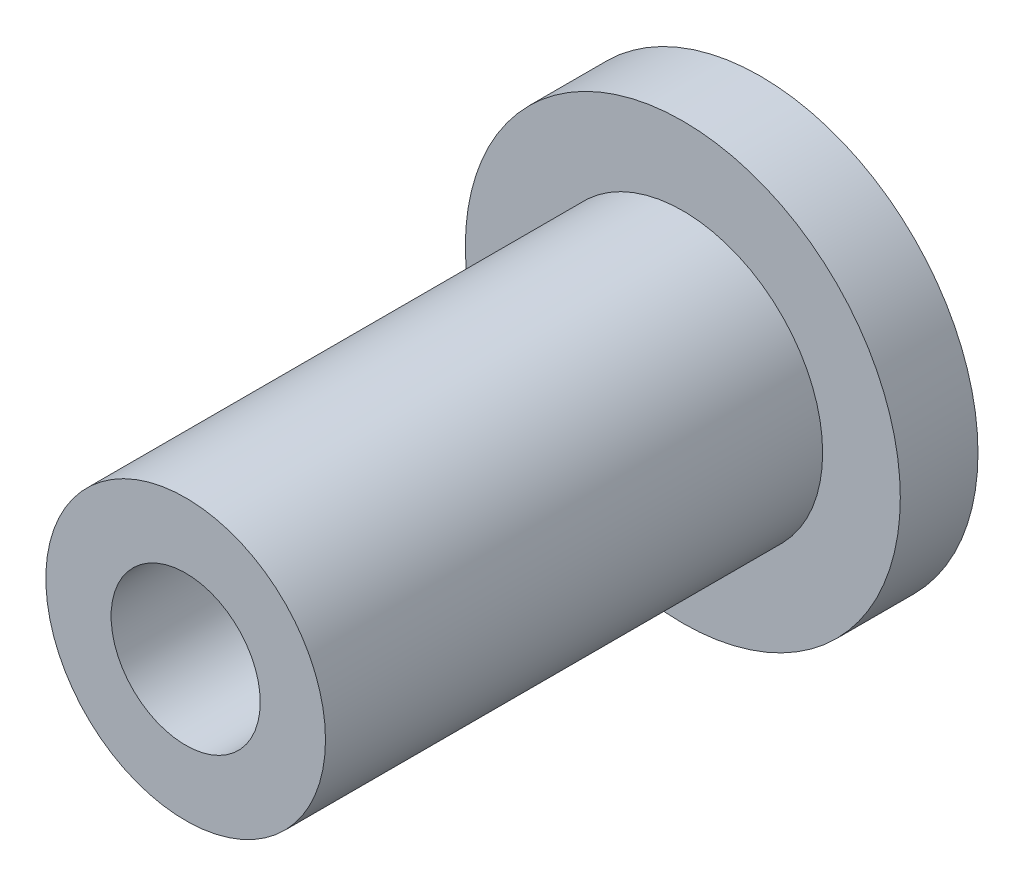
ISO-10303-21;
HEADER;
FILE_DESCRIPTION(('STEP AP214'),'2;1');
FILE_NAME('part.step','',(''),(''),'','','');
FILE_SCHEMA(('AUTOMOTIVE_DESIGN { 1 0 10303 214 1 1 1 1 }'));
ENDSEC;
DATA;
#1=APPLICATION_CONTEXT('core data for automotive mechanical design processes');
#2=APPLICATION_PROTOCOL_DEFINITION('international standard','automotive_design',2000,#1);
#3=PRODUCT_CONTEXT('',#1,'mechanical');
#4=PRODUCT('Part','Part','',(#3));
#5=PRODUCT_RELATED_PRODUCT_CATEGORY('part','',(#4));
#6=PRODUCT_DEFINITION_FORMATION('','',#4);
#7=PRODUCT_DEFINITION_CONTEXT('part definition',#1,'design');
#8=PRODUCT_DEFINITION('design','',#6,#7);
#9=PRODUCT_DEFINITION_SHAPE('','',#8);
#10=(LENGTH_UNIT() NAMED_UNIT(*) SI_UNIT(.MILLI.,.METRE.));
#11=(NAMED_UNIT(*) PLANE_ANGLE_UNIT() SI_UNIT($,.RADIAN.));
#12=(NAMED_UNIT(*) SI_UNIT($,.STERADIAN.) SOLID_ANGLE_UNIT());
#13=UNCERTAINTY_MEASURE_WITH_UNIT(LENGTH_MEASURE(1.E-05),#10,'distance_accuracy_value','');
#14=(GEOMETRIC_REPRESENTATION_CONTEXT(3) GLOBAL_UNCERTAINTY_ASSIGNED_CONTEXT((#13)) GLOBAL_UNIT_ASSIGNED_CONTEXT((#10,
#11,#12)) REPRESENTATION_CONTEXT('',''));
#15=CARTESIAN_POINT('',(0.,0.,0.));
#16=DIRECTION('',(0.,0.,1.));
#17=DIRECTION('',(1.,0.,0.));
#18=AXIS2_PLACEMENT_3D('',#15,#16,#17);
#19=CARTESIAN_POINT('',(0.,0.,2.5));
#20=DIRECTION('',(0.,0.,-1.));
#21=DIRECTION('',(-1.,0.,0.));
#22=AXIS2_PLACEMENT_3D('',#19,#20,#21);
#23=CYLINDRICAL_SURFACE('',#22,7.);
#24=CARTESIAN_POINT('',(0.,0.,2.5));
#25=DIRECTION('',(0.,0.,1.));
#26=DIRECTION('',(1.,0.,0.));
#27=AXIS2_PLACEMENT_3D('',#24,#25,#26);
#28=CIRCLE('',#27,7.);
#29=CARTESIAN_POINT('',(7.,0.,2.5));
#30=VERTEX_POINT('',#29);
#31=EDGE_CURVE('E44',#30,#30,#28,.T.);
#32=ORIENTED_EDGE('',*,*,#31,.F.);
#33=EDGE_LOOP('',(#32));
#34=FACE_BOUND('',#33,.T.);
#35=CARTESIAN_POINT('',(0.,0.,0.));
#36=DIRECTION('',(0.,0.,1.));
#37=DIRECTION('',(1.,0.,0.));
#38=AXIS2_PLACEMENT_3D('',#35,#36,#37);
#39=CIRCLE('',#38,7.);
#40=CARTESIAN_POINT('',(7.,0.,0.));
#41=VERTEX_POINT('',#40);
#42=EDGE_CURVE('E39',#41,#41,#39,.T.);
#43=ORIENTED_EDGE('',*,*,#42,.T.);
#44=EDGE_LOOP('',(#43));
#45=FACE_BOUND('',#44,.T.);
#46=ADVANCED_FACE('F36',(#34,#45),#23,.T.);
#47=CARTESIAN_POINT('',(0.,0.,2.5));
#48=DIRECTION('',(0.,0.,1.));
#49=DIRECTION('',(1.,0.,0.));
#50=AXIS2_PLACEMENT_3D('',#47,#48,#49);
#51=PLANE('',#50);
#52=CARTESIAN_POINT('',(0.,0.,2.5));
#53=DIRECTION('',(0.,0.,1.));
#54=DIRECTION('',(1.,0.,0.));
#55=AXIS2_PLACEMENT_3D('',#52,#53,#54);
#56=CIRCLE('',#55,4.5);
#57=CARTESIAN_POINT('',(4.5,0.,2.5));
#58=VERTEX_POINT('',#57);
#59=EDGE_CURVE('E10',#58,#58,#56,.T.);
#60=ORIENTED_EDGE('',*,*,#59,.F.);
#61=EDGE_LOOP('',(#60));
#62=FACE_BOUND('',#61,.T.);
#63=ORIENTED_EDGE('',*,*,#31,.T.);
#64=EDGE_LOOP('',(#63));
#65=FACE_BOUND('',#64,.T.);
#66=ADVANCED_FACE('F85',(#62,#65),#51,.T.);
#67=CARTESIAN_POINT('',(0.,0.,0.));
#68=DIRECTION('',(0.,0.,1.));
#69=DIRECTION('',(1.,0.,0.));
#70=AXIS2_PLACEMENT_3D('',#67,#68,#69);
#71=PLANE('',#70);
#72=ORIENTED_EDGE('',*,*,#42,.F.);
#73=EDGE_LOOP('',(#72));
#74=FACE_BOUND('',#73,.T.);
#75=ADVANCED_FACE('F80',(#74),#71,.F.);
#76=CARTESIAN_POINT('',(0.,0.,18.5));
#77=DIRECTION('',(0.,0.,-1.));
#78=DIRECTION('',(-1.,0.,0.));
#79=AXIS2_PLACEMENT_3D('',#76,#77,#78);
#80=CYLINDRICAL_SURFACE('',#79,4.5);
#81=CARTESIAN_POINT('',(0.,0.,18.5));
#82=DIRECTION('',(0.,0.,1.));
#83=DIRECTION('',(1.,0.,0.));
#84=AXIS2_PLACEMENT_3D('',#81,#82,#83);
#85=CIRCLE('',#84,4.5);
#86=CARTESIAN_POINT('',(4.5,0.,18.5));
#87=VERTEX_POINT('',#86);
#88=EDGE_CURVE('E51',#87,#87,#85,.T.);
#89=ORIENTED_EDGE('',*,*,#88,.F.);
#90=EDGE_LOOP('',(#89));
#91=FACE_BOUND('',#90,.T.);
#92=ORIENTED_EDGE('',*,*,#59,.T.);
#93=EDGE_LOOP('',(#92));
#94=FACE_BOUND('',#93,.T.);
#95=ADVANCED_FACE('F75',(#91,#94),#80,.T.);
#96=CARTESIAN_POINT('',(0.,0.,18.5));
#97=DIRECTION('',(0.,0.,1.));
#98=DIRECTION('',(1.,0.,0.));
#99=AXIS2_PLACEMENT_3D('',#96,#97,#98);
#100=PLANE('',#99);
#101=CARTESIAN_POINT('',(0.,0.,18.5));
#102=DIRECTION('',(0.,0.,1.));
#103=DIRECTION('',(1.,0.,0.));
#104=AXIS2_PLACEMENT_3D('',#101,#102,#103);
#105=CIRCLE('',#104,2.4);
#106=CARTESIAN_POINT('',(2.4,0.,18.5));
#107=VERTEX_POINT('',#106);
#108=EDGE_CURVE('E56',#107,#107,#105,.T.);
#109=ORIENTED_EDGE('',*,*,#108,.F.);
#110=EDGE_LOOP('',(#109));
#111=FACE_BOUND('',#110,.T.);
#112=ORIENTED_EDGE('',*,*,#88,.T.);
#113=EDGE_LOOP('',(#112));
#114=FACE_BOUND('',#113,.T.);
#115=ADVANCED_FACE('F69',(#111,#114),#100,.T.);
#116=CARTESIAN_POINT('',(0.,0.,13.5));
#117=DIRECTION('',(0.,0.,1.));
#118=DIRECTION('',(1.,0.,0.));
#119=AXIS2_PLACEMENT_3D('',#116,#117,#118);
#120=CYLINDRICAL_SURFACE('',#119,2.4);
#121=CARTESIAN_POINT('',(0.,0.,13.5));
#122=DIRECTION('',(0.,0.,1.));
#123=DIRECTION('',(1.,0.,0.));
#124=AXIS2_PLACEMENT_3D('',#121,#122,#123);
#125=CIRCLE('',#124,2.4);
#126=CARTESIAN_POINT('',(2.4,0.,13.5));
#127=VERTEX_POINT('',#126);
#128=EDGE_CURVE('E55',#127,#127,#125,.T.);
#129=ORIENTED_EDGE('',*,*,#128,.F.);
#130=EDGE_LOOP('',(#129));
#131=FACE_BOUND('',#130,.T.);
#132=ORIENTED_EDGE('',*,*,#108,.T.);
#133=EDGE_LOOP('',(#132));
#134=FACE_BOUND('',#133,.T.);
#135=ADVANCED_FACE('F66',(#131,#134),#120,.F.);
#136=CARTESIAN_POINT('',(0.,0.,13.5));
#137=DIRECTION('',(0.,0.,1.));
#138=DIRECTION('',(1.,0.,0.));
#139=AXIS2_PLACEMENT_3D('',#136,#137,#138);
#140=PLANE('',#139);
#141=ORIENTED_EDGE('',*,*,#128,.T.);
#142=EDGE_LOOP('',(#141));
#143=FACE_BOUND('',#142,.T.);
#144=ADVANCED_FACE('F64',(#143),#140,.T.);
#145=CLOSED_SHELL('',(#46,#66,#75,#95,#115,#135,#144));
#146=MANIFOLD_SOLID_BREP('B2',#145);
#147=ADVANCED_BREP_SHAPE_REPRESENTATION('',(#18,#146),#14);
#148=SHAPE_DEFINITION_REPRESENTATION(#9,#147);
ENDSEC;
END-ISO-10303-21;
